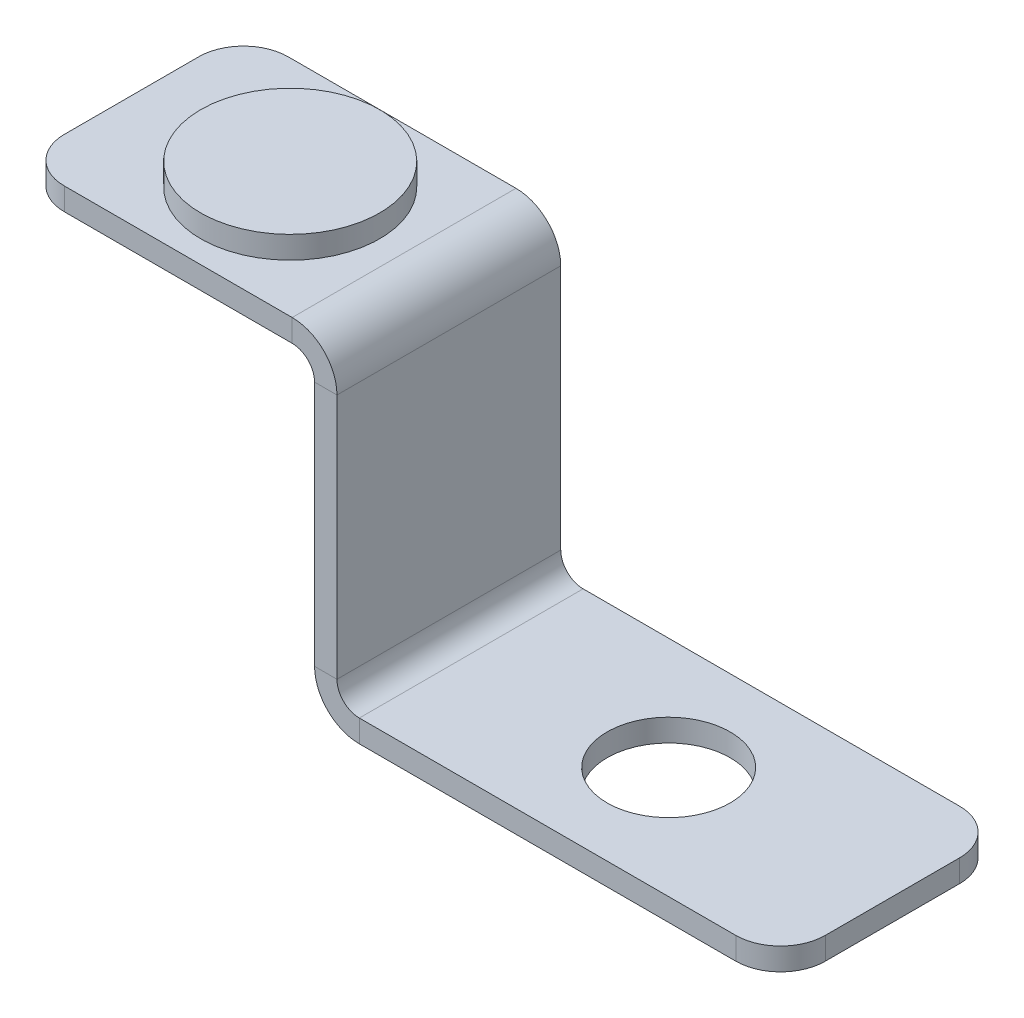
ISO-10303-21;
HEADER;
FILE_DESCRIPTION(('STEP AP214'),'2;1');
FILE_NAME('part.step','',(''),(''),'','','');
FILE_SCHEMA(('AUTOMOTIVE_DESIGN { 1 0 10303 214 1 1 1 1 }'));
ENDSEC;
DATA;
#1=APPLICATION_CONTEXT('core data for automotive mechanical design processes');
#2=APPLICATION_PROTOCOL_DEFINITION('international standard','automotive_design',2000,#1);
#3=PRODUCT_CONTEXT('',#1,'mechanical');
#4=PRODUCT('Part','Part','',(#3));
#5=PRODUCT_RELATED_PRODUCT_CATEGORY('part','',(#4));
#6=PRODUCT_DEFINITION_FORMATION('','',#4);
#7=PRODUCT_DEFINITION_CONTEXT('part definition',#1,'design');
#8=PRODUCT_DEFINITION('design','',#6,#7);
#9=PRODUCT_DEFINITION_SHAPE('','',#8);
#10=(LENGTH_UNIT() NAMED_UNIT(*) SI_UNIT(.MILLI.,.METRE.));
#11=(NAMED_UNIT(*) PLANE_ANGLE_UNIT() SI_UNIT($,.RADIAN.));
#12=(NAMED_UNIT(*) SI_UNIT($,.STERADIAN.) SOLID_ANGLE_UNIT());
#13=UNCERTAINTY_MEASURE_WITH_UNIT(LENGTH_MEASURE(1.E-05),#10,'distance_accuracy_value','');
#14=(GEOMETRIC_REPRESENTATION_CONTEXT(3) GLOBAL_UNCERTAINTY_ASSIGNED_CONTEXT((#13)) GLOBAL_UNIT_ASSIGNED_CONTEXT((#10,
#11,#12)) REPRESENTATION_CONTEXT('',''));
#15=CARTESIAN_POINT('',(0.,0.,0.));
#16=DIRECTION('',(0.,0.,1.));
#17=DIRECTION('',(1.,0.,0.));
#18=AXIS2_PLACEMENT_3D('',#15,#16,#17);
#19=CARTESIAN_POINT('',(7.08904862254811,16.,-5.));
#20=DIRECTION('',(0.,-1.,0.));
#21=DIRECTION('',(1.,0.,0.));
#22=AXIS2_PLACEMENT_3D('',#19,#20,#21);
#23=CYLINDRICAL_SURFACE('',#22,4.);
#24=CARTESIAN_POINT('',(7.08904862254811,16.,-5.));
#25=DIRECTION('',(0.,1.,0.));
#26=DIRECTION('',(-1.,0.,0.));
#27=AXIS2_PLACEMENT_3D('',#24,#25,#26);
#28=CIRCLE('',#27,4.);
#29=CARTESIAN_POINT('',(3.08904862254811,16.,-5.));
#30=VERTEX_POINT('',#29);
#31=EDGE_CURVE('E12',#30,#30,#28,.T.);
#32=ORIENTED_EDGE('',*,*,#31,.F.);
#33=EDGE_LOOP('',(#32));
#34=FACE_BOUND('',#33,.T.);
#35=CARTESIAN_POINT('',(7.08904862254811,15.,-5.));
#36=DIRECTION('',(0.,1.,0.));
#37=DIRECTION('',(-1.,0.,0.));
#38=AXIS2_PLACEMENT_3D('',#35,#36,#37);
#39=CIRCLE('',#38,4.);
#40=CARTESIAN_POINT('',(3.08904862254811,15.,-5.));
#41=VERTEX_POINT('',#40);
#42=EDGE_CURVE('E55',#41,#41,#39,.T.);
#43=ORIENTED_EDGE('',*,*,#42,.T.);
#44=EDGE_LOOP('',(#43));
#45=FACE_BOUND('',#44,.T.);
#46=ADVANCED_FACE('F52',(#34,#45),#23,.T.);
#47=CARTESIAN_POINT('',(7.08904862254811,16.,-5.));
#48=DIRECTION('',(0.,1.,0.));
#49=DIRECTION('',(-1.,0.,0.));
#50=AXIS2_PLACEMENT_3D('',#47,#48,#49);
#51=PLANE('',#50);
#52=ORIENTED_EDGE('',*,*,#31,.T.);
#53=EDGE_LOOP('',(#52));
#54=FACE_BOUND('',#53,.T.);
#55=ADVANCED_FACE('F67',(#54),#51,.T.);
#56=CARTESIAN_POINT('',(7.08904862254811,15.,-5.));
#57=DIRECTION('',(0.,1.,0.));
#58=DIRECTION('',(-1.,0.,0.));
#59=AXIS2_PLACEMENT_3D('',#56,#57,#58);
#60=PLANE('',#59);
#61=ORIENTED_EDGE('',*,*,#42,.F.);
#62=EDGE_LOOP('',(#61));
#63=FACE_BOUND('',#62,.T.);
#64=ADVANCED_FACE('F65',(#63),#60,.F.);
#65=CLOSED_SHELL('',(#46,#55,#64));
#66=MANIFOLD_SOLID_BREP('B2',#65);
#67=CARTESIAN_POINT('',(14.1780972450962,12.8219027549038,0.));
#68=DIRECTION('',(0.,0.,-1.));
#69=DIRECTION('',(0.,1.,0.));
#70=AXIS2_PLACEMENT_3D('',#67,#68,#69);
#71=PLANE('',#70);
#72=DIRECTION('',(0.,-1.,0.));
#73=VECTOR('',#72,1.);
#74=CARTESIAN_POINT('',(14.1780972450962,12.8219027549038,0.));
#75=LINE('',#74,#73);
#76=CARTESIAN_POINT('',(14.1780972450962,13.,0.));
#77=VERTEX_POINT('',#76);
#78=CARTESIAN_POINT('',(14.1780972450962,2.,0.));
#79=VERTEX_POINT('',#78);
#80=EDGE_CURVE('E344',#77,#79,#75,.T.);
#81=ORIENTED_EDGE('',*,*,#80,.F.);
#82=DIRECTION('',(-1.,0.,0.));
#83=VECTOR('',#82,1.);
#84=CARTESIAN_POINT('',(14.1780972450962,13.,0.));
#85=LINE('',#84,#83);
#86=CARTESIAN_POINT('',(13.1780972450962,13.,0.));
#87=VERTEX_POINT('',#86);
#88=EDGE_CURVE('E50',#77,#87,#85,.T.);
#89=ORIENTED_EDGE('',*,*,#88,.T.);
#90=DIRECTION('',(0.,-1.,0.));
#91=VECTOR('',#90,1.);
#92=CARTESIAN_POINT('',(13.1780972450962,12.8219027549038,0.));
#93=LINE('',#92,#91);
#94=CARTESIAN_POINT('',(13.1780972450962,2.00000000000001,0.));
#95=VERTEX_POINT('',#94);
#96=EDGE_CURVE('E359',#87,#95,#93,.T.);
#97=ORIENTED_EDGE('',*,*,#96,.T.);
#98=DIRECTION('',(-1.,0.,0.));
#99=VECTOR('',#98,1.);
#100=CARTESIAN_POINT('',(14.1780972450962,2.,0.));
#101=LINE('',#100,#99);
#102=EDGE_CURVE('E343',#79,#95,#101,.T.);
#103=ORIENTED_EDGE('',*,*,#102,.F.);
#104=EDGE_LOOP('',(#81,#89,#97,#103));
#105=FACE_BOUND('',#104,.T.);
#106=ADVANCED_FACE('F92',(#105),#71,.F.);
#107=CARTESIAN_POINT('',(14.1780972450962,12.8219027549038,-10.));
#108=DIRECTION('',(0.,0.,1.));
#109=DIRECTION('',(0.,-1.,0.));
#110=AXIS2_PLACEMENT_3D('',#107,#108,#109);
#111=PLANE('',#110);
#112=DIRECTION('',(0.,1.,0.));
#113=VECTOR('',#112,1.);
#114=CARTESIAN_POINT('',(13.1780972450962,12.8219027549038,-10.));
#115=LINE('',#114,#113);
#116=CARTESIAN_POINT('',(13.1780972450962,2.00000000000001,-10.));
#117=VERTEX_POINT('',#116);
#118=CARTESIAN_POINT('',(13.1780972450962,13.,-10.));
#119=VERTEX_POINT('',#118);
#120=EDGE_CURVE('E114',#117,#119,#115,.T.);
#121=ORIENTED_EDGE('',*,*,#120,.T.);
#122=DIRECTION('',(1.,0.,0.));
#123=VECTOR('',#122,1.);
#124=CARTESIAN_POINT('',(14.1780972450962,13.,-10.));
#125=LINE('',#124,#123);
#126=CARTESIAN_POINT('',(14.1780972450962,13.,-10.));
#127=VERTEX_POINT('',#126);
#128=EDGE_CURVE('E355',#119,#127,#125,.T.);
#129=ORIENTED_EDGE('',*,*,#128,.T.);
#130=DIRECTION('',(0.,1.,0.));
#131=VECTOR('',#130,1.);
#132=CARTESIAN_POINT('',(14.1780972450962,12.8219027549038,-10.));
#133=LINE('',#132,#131);
#134=CARTESIAN_POINT('',(14.1780972450962,2.,-10.));
#135=VERTEX_POINT('',#134);
#136=EDGE_CURVE('E95',#135,#127,#133,.T.);
#137=ORIENTED_EDGE('',*,*,#136,.F.);
#138=DIRECTION('',(1.,0.,0.));
#139=VECTOR('',#138,1.);
#140=CARTESIAN_POINT('',(14.1780972450962,2.,-10.));
#141=LINE('',#140,#139);
#142=EDGE_CURVE('E349',#117,#135,#141,.T.);
#143=ORIENTED_EDGE('',*,*,#142,.F.);
#144=EDGE_LOOP('',(#121,#129,#137,#143));
#145=FACE_BOUND('',#144,.T.);
#146=ADVANCED_FACE('F369',(#145),#111,.F.);
#147=CARTESIAN_POINT('',(14.1780972450961,-17.1780972450962,-8.));
#148=DIRECTION('',(-1.,0.,0.));
#149=DIRECTION('',(0.,0.,-1.));
#150=AXIS2_PLACEMENT_3D('',#147,#148,#149);
#151=PLANE('',#150);
#152=ORIENTED_EDGE('',*,*,#136,.T.);
#153=DIRECTION('',(0.,0.,1.));
#154=VECTOR('',#153,1.);
#155=CARTESIAN_POINT('',(14.1780972450962,13.,-8.));
#156=LINE('',#155,#154);
#157=EDGE_CURVE('E352',#127,#77,#156,.T.);
#158=ORIENTED_EDGE('',*,*,#157,.T.);
#159=ORIENTED_EDGE('',*,*,#80,.T.);
#160=DIRECTION('',(0.,0.,1.));
#161=VECTOR('',#160,1.);
#162=CARTESIAN_POINT('',(14.1780972450962,2.,-8.));
#163=LINE('',#162,#161);
#164=EDGE_CURVE('E340',#135,#79,#163,.T.);
#165=ORIENTED_EDGE('',*,*,#164,.F.);
#166=EDGE_LOOP('',(#152,#158,#159,#165));
#167=FACE_BOUND('',#166,.T.);
#168=ADVANCED_FACE('F366',(#167),#151,.F.);
#169=CARTESIAN_POINT('',(13.1780972450961,-17.1780972450962,-8.));
#170=DIRECTION('',(-1.,0.,0.));
#171=DIRECTION('',(0.,0.,-1.));
#172=AXIS2_PLACEMENT_3D('',#169,#170,#171);
#173=PLANE('',#172);
#174=DIRECTION('',(0.,0.,1.));
#175=VECTOR('',#174,1.);
#176=CARTESIAN_POINT('',(13.1780972450962,13.,-8.));
#177=LINE('',#176,#175);
#178=EDGE_CURVE('E100',#119,#87,#177,.T.);
#179=ORIENTED_EDGE('',*,*,#178,.F.);
#180=ORIENTED_EDGE('',*,*,#120,.F.);
#181=DIRECTION('',(0.,0.,1.));
#182=VECTOR('',#181,1.);
#183=CARTESIAN_POINT('',(13.1780972450962,2.00000000000001,-8.));
#184=LINE('',#183,#182);
#185=EDGE_CURVE('E347',#117,#95,#184,.T.);
#186=ORIENTED_EDGE('',*,*,#185,.T.);
#187=ORIENTED_EDGE('',*,*,#96,.F.);
#188=EDGE_LOOP('',(#179,#180,#186,#187));
#189=FACE_BOUND('',#188,.T.);
#190=ADVANCED_FACE('F455',(#189),#173,.T.);
#191=CARTESIAN_POINT('',(32.,1.,-8.));
#192=DIRECTION('',(0.,-1.,0.));
#193=DIRECTION('',(0.,0.,-1.));
#194=AXIS2_PLACEMENT_3D('',#191,#192,#193);
#195=CYLINDRICAL_SURFACE('',#194,2.);
#196=CARTESIAN_POINT('',(32.,0.,-8.));
#197=DIRECTION('',(0.,1.,0.));
#198=DIRECTION('',(0.,0.,-1.));
#199=AXIS2_PLACEMENT_3D('',#196,#197,#198);
#200=CIRCLE('',#199,2.);
#201=CARTESIAN_POINT('',(34.,0.,-7.99999999999999));
#202=VERTEX_POINT('',#201);
#203=CARTESIAN_POINT('',(32.,0.,-10.));
#204=VERTEX_POINT('',#203);
#205=EDGE_CURVE('E336',#202,#204,#200,.T.);
#206=ORIENTED_EDGE('',*,*,#205,.T.);
#207=DIRECTION('',(0.,-1.,0.));
#208=VECTOR('',#207,1.);
#209=CARTESIAN_POINT('',(32.,1.,-10.));
#210=LINE('',#209,#208);
#211=CARTESIAN_POINT('',(32.,1.,-10.));
#212=VERTEX_POINT('',#211);
#213=EDGE_CURVE('E288',#212,#204,#210,.T.);
#214=ORIENTED_EDGE('',*,*,#213,.F.);
#215=CARTESIAN_POINT('',(32.,1.,-8.));
#216=DIRECTION('',(0.,1.,0.));
#217=DIRECTION('',(0.,0.,-1.));
#218=AXIS2_PLACEMENT_3D('',#215,#216,#217);
#219=CIRCLE('',#218,2.);
#220=CARTESIAN_POINT('',(34.,1.,-7.99999999999999));
#221=VERTEX_POINT('',#220);
#222=EDGE_CURVE('E305',#221,#212,#219,.T.);
#223=ORIENTED_EDGE('',*,*,#222,.F.);
#224=DIRECTION('',(0.,-1.,0.));
#225=VECTOR('',#224,1.);
#226=CARTESIAN_POINT('',(34.,1.,-7.99999999999999));
#227=LINE('',#226,#225);
#228=EDGE_CURVE('E333',#221,#202,#227,.T.);
#229=ORIENTED_EDGE('',*,*,#228,.T.);
#230=EDGE_LOOP('',(#206,#214,#223,#229));
#231=FACE_BOUND('',#230,.T.);
#232=ADVANCED_FACE('F451',(#231),#195,.T.);
#233=CARTESIAN_POINT('',(34.,1.,-2.00000000000002));
#234=DIRECTION('',(-1.,0.,0.));
#235=DIRECTION('',(0.,0.,1.));
#236=AXIS2_PLACEMENT_3D('',#233,#234,#235);
#237=PLANE('',#236);
#238=DIRECTION('',(0.,0.,-1.));
#239=VECTOR('',#238,1.);
#240=CARTESIAN_POINT('',(34.,0.,-2.00000000000002));
#241=LINE('',#240,#239);
#242=CARTESIAN_POINT('',(34.,0.,-2.00000000000002));
#243=VERTEX_POINT('',#242);
#244=EDGE_CURVE('E331',#243,#202,#241,.T.);
#245=ORIENTED_EDGE('',*,*,#244,.T.);
#246=ORIENTED_EDGE('',*,*,#228,.F.);
#247=DIRECTION('',(0.,0.,-1.));
#248=VECTOR('',#247,1.);
#249=CARTESIAN_POINT('',(34.,1.,-2.00000000000002));
#250=LINE('',#249,#248);
#251=CARTESIAN_POINT('',(34.,1.,-2.00000000000002));
#252=VERTEX_POINT('',#251);
#253=EDGE_CURVE('E308',#252,#221,#250,.T.);
#254=ORIENTED_EDGE('',*,*,#253,.F.);
#255=DIRECTION('',(0.,-1.,0.));
#256=VECTOR('',#255,1.);
#257=CARTESIAN_POINT('',(34.,1.,-2.00000000000002));
#258=LINE('',#257,#256);
#259=EDGE_CURVE('E328',#252,#243,#258,.T.);
#260=ORIENTED_EDGE('',*,*,#259,.T.);
#261=EDGE_LOOP('',(#245,#246,#254,#260));
#262=FACE_BOUND('',#261,.T.);
#263=ADVANCED_FACE('F454',(#262),#237,.F.);
#264=CARTESIAN_POINT('',(32.,1.,-2.));
#265=DIRECTION('',(0.,-1.,0.));
#266=DIRECTION('',(0.,0.,-1.));
#267=AXIS2_PLACEMENT_3D('',#264,#265,#266);
#268=CYLINDRICAL_SURFACE('',#267,2.);
#269=CARTESIAN_POINT('',(32.,0.,-2.));
#270=DIRECTION('',(0.,1.,0.));
#271=DIRECTION('',(0.,0.,1.));
#272=AXIS2_PLACEMENT_3D('',#269,#270,#271);
#273=CIRCLE('',#272,2.);
#274=CARTESIAN_POINT('',(32.,0.,0.));
#275=VERTEX_POINT('',#274);
#276=EDGE_CURVE('E326',#275,#243,#273,.T.);
#277=ORIENTED_EDGE('',*,*,#276,.T.);
#278=ORIENTED_EDGE('',*,*,#259,.F.);
#279=CARTESIAN_POINT('',(32.,1.,-2.));
#280=DIRECTION('',(0.,1.,0.));
#281=DIRECTION('',(0.,0.,1.));
#282=AXIS2_PLACEMENT_3D('',#279,#280,#281);
#283=CIRCLE('',#282,2.);
#284=CARTESIAN_POINT('',(32.,1.,0.));
#285=VERTEX_POINT('',#284);
#286=EDGE_CURVE('E310',#285,#252,#283,.T.);
#287=ORIENTED_EDGE('',*,*,#286,.F.);
#288=DIRECTION('',(0.,-1.,0.));
#289=VECTOR('',#288,1.);
#290=CARTESIAN_POINT('',(32.,1.,0.));
#291=LINE('',#290,#289);
#292=EDGE_CURVE('E323',#285,#275,#291,.T.);
#293=ORIENTED_EDGE('',*,*,#292,.T.);
#294=EDGE_LOOP('',(#277,#278,#287,#293));
#295=FACE_BOUND('',#294,.T.);
#296=ADVANCED_FACE('F459',(#295),#268,.T.);
#297=CARTESIAN_POINT('',(24.,1.,-5.));
#298=DIRECTION('',(0.,-1.,0.));
#299=DIRECTION('',(0.,0.,-1.));
#300=AXIS2_PLACEMENT_3D('',#297,#298,#299);
#301=CYLINDRICAL_SURFACE('',#300,2.75);
#302=CARTESIAN_POINT('',(24.,1.,-5.));
#303=DIRECTION('',(0.,1.,0.));
#304=DIRECTION('',(0.,0.,1.));
#305=AXIS2_PLACEMENT_3D('',#302,#303,#304);
#306=CIRCLE('',#305,2.75);
#307=CARTESIAN_POINT('',(24.,1.,-2.25));
#308=VERTEX_POINT('',#307);
#309=EDGE_CURVE('E320',#308,#308,#306,.T.);
#310=ORIENTED_EDGE('',*,*,#309,.T.);
#311=EDGE_LOOP('',(#310));
#312=FACE_BOUND('',#311,.T.);
#313=CARTESIAN_POINT('',(24.,0.,-5.));
#314=DIRECTION('',(0.,1.,0.));
#315=DIRECTION('',(0.,0.,1.));
#316=AXIS2_PLACEMENT_3D('',#313,#314,#315);
#317=CIRCLE('',#316,2.75);
#318=CARTESIAN_POINT('',(24.,0.,-2.25));
#319=VERTEX_POINT('',#318);
#320=EDGE_CURVE('E297',#319,#319,#317,.T.);
#321=ORIENTED_EDGE('',*,*,#320,.F.);
#322=EDGE_LOOP('',(#321));
#323=FACE_BOUND('',#322,.T.);
#324=ADVANCED_FACE('F463',(#312,#323),#301,.F.);
#325=CARTESIAN_POINT('',(32.,1.,-8.));
#326=DIRECTION('',(0.,-1.,0.));
#327=DIRECTION('',(0.,0.,-1.));
#328=AXIS2_PLACEMENT_3D('',#325,#326,#327);
#329=PLANE('',#328);
#330=ORIENTED_EDGE('',*,*,#309,.F.);
#331=EDGE_LOOP('',(#330));
#332=FACE_BOUND('',#331,.T.);
#333=DIRECTION('',(-1.,0.,0.));
#334=VECTOR('',#333,1.);
#335=CARTESIAN_POINT('',(2.00000000000001,1.,-10.));
#336=LINE('',#335,#334);
#337=CARTESIAN_POINT('',(15.1780972450962,1.,-10.));
#338=VERTEX_POINT('',#337);
#339=EDGE_CURVE('E317',#212,#338,#336,.T.);
#340=ORIENTED_EDGE('',*,*,#339,.T.);
#341=DIRECTION('',(0.,0.,1.));
#342=VECTOR('',#341,1.);
#343=CARTESIAN_POINT('',(15.1780972450962,1.,-8.));
#344=LINE('',#343,#342);
#345=CARTESIAN_POINT('',(15.1780972450962,1.,0.));
#346=VERTEX_POINT('',#345);
#347=EDGE_CURVE('E314',#338,#346,#344,.T.);
#348=ORIENTED_EDGE('',*,*,#347,.T.);
#349=DIRECTION('',(1.,0.,0.));
#350=VECTOR('',#349,1.);
#351=CARTESIAN_POINT('',(2.00000000000001,1.,0.));
#352=LINE('',#351,#350);
#353=EDGE_CURVE('E312',#346,#285,#352,.T.);
#354=ORIENTED_EDGE('',*,*,#353,.T.);
#355=ORIENTED_EDGE('',*,*,#286,.T.);
#356=ORIENTED_EDGE('',*,*,#253,.T.);
#357=ORIENTED_EDGE('',*,*,#222,.T.);
#358=EDGE_LOOP('',(#340,#348,#354,#355,#356,#357));
#359=FACE_BOUND('',#358,.T.);
#360=ADVANCED_FACE('F434',(#332,#359),#329,.F.);
#361=CARTESIAN_POINT('',(2.00000000000001,1.,0.));
#362=DIRECTION('',(0.,0.,-1.));
#363=DIRECTION('',(-1.,0.,0.));
#364=AXIS2_PLACEMENT_3D('',#361,#362,#363);
#365=PLANE('',#364);
#366=ORIENTED_EDGE('',*,*,#353,.F.);
#367=DIRECTION('',(0.,-1.,0.));
#368=VECTOR('',#367,1.);
#369=CARTESIAN_POINT('',(15.1780972450962,1.,0.));
#370=LINE('',#369,#368);
#371=CARTESIAN_POINT('',(15.1780972450962,0.,0.));
#372=VERTEX_POINT('',#371);
#373=EDGE_CURVE('E302',#346,#372,#370,.T.);
#374=ORIENTED_EDGE('',*,*,#373,.T.);
#375=DIRECTION('',(1.,0.,0.));
#376=VECTOR('',#375,1.);
#377=CARTESIAN_POINT('',(2.00000000000001,0.,0.));
#378=LINE('',#377,#376);
#379=EDGE_CURVE('E300',#372,#275,#378,.T.);
#380=ORIENTED_EDGE('',*,*,#379,.T.);
#381=ORIENTED_EDGE('',*,*,#292,.F.);
#382=EDGE_LOOP('',(#366,#374,#380,#381));
#383=FACE_BOUND('',#382,.T.);
#384=ADVANCED_FACE('F429',(#383),#365,.F.);
#385=CARTESIAN_POINT('',(32.,0.,-8.));
#386=DIRECTION('',(0.,-1.,0.));
#387=DIRECTION('',(0.,0.,-1.));
#388=AXIS2_PLACEMENT_3D('',#385,#386,#387);
#389=PLANE('',#388);
#390=DIRECTION('',(0.,0.,1.));
#391=VECTOR('',#390,1.);
#392=CARTESIAN_POINT('',(15.1780972450962,0.,-8.));
#393=LINE('',#392,#391);
#394=CARTESIAN_POINT('',(15.1780972450962,0.,-10.));
#395=VERTEX_POINT('',#394);
#396=EDGE_CURVE('E283',#395,#372,#393,.T.);
#397=ORIENTED_EDGE('',*,*,#396,.F.);
#398=DIRECTION('',(-1.,0.,0.));
#399=VECTOR('',#398,1.);
#400=CARTESIAN_POINT('',(2.00000000000001,0.,-10.));
#401=LINE('',#400,#399);
#402=EDGE_CURVE('E294',#204,#395,#401,.T.);
#403=ORIENTED_EDGE('',*,*,#402,.F.);
#404=ORIENTED_EDGE('',*,*,#205,.F.);
#405=ORIENTED_EDGE('',*,*,#244,.F.);
#406=ORIENTED_EDGE('',*,*,#276,.F.);
#407=ORIENTED_EDGE('',*,*,#379,.F.);
#408=EDGE_LOOP('',(#397,#403,#404,#405,#406,#407));
#409=FACE_BOUND('',#408,.T.);
#410=ORIENTED_EDGE('',*,*,#320,.T.);
#411=EDGE_LOOP('',(#410));
#412=FACE_BOUND('',#411,.T.);
#413=ADVANCED_FACE('F421',(#409,#412),#389,.T.);
#414=CARTESIAN_POINT('',(2.00000000000001,1.,-10.));
#415=DIRECTION('',(0.,0.,1.));
#416=DIRECTION('',(1.,0.,0.));
#417=AXIS2_PLACEMENT_3D('',#414,#415,#416);
#418=PLANE('',#417);
#419=ORIENTED_EDGE('',*,*,#402,.T.);
#420=DIRECTION('',(0.,1.,0.));
#421=VECTOR('',#420,1.);
#422=CARTESIAN_POINT('',(15.1780972450962,1.,-10.));
#423=LINE('',#422,#421);
#424=EDGE_CURVE('E291',#395,#338,#423,.T.);
#425=ORIENTED_EDGE('',*,*,#424,.T.);
#426=ORIENTED_EDGE('',*,*,#339,.F.);
#427=ORIENTED_EDGE('',*,*,#213,.T.);
#428=EDGE_LOOP('',(#419,#425,#426,#427));
#429=FACE_BOUND('',#428,.T.);
#430=ADVANCED_FACE('F438',(#429),#418,.F.);
#431=CARTESIAN_POINT('',(15.1780972450962,2.,-10.));
#432=DIRECTION('',(0.,0.,1.));
#433=DIRECTION('',(1.,0.,0.));
#434=AXIS2_PLACEMENT_3D('',#431,#432,#433);
#435=PLANE('',#434);
#436=ORIENTED_EDGE('',*,*,#424,.F.);
#437=CARTESIAN_POINT('',(15.1780972450962,2.,-10.));
#438=DIRECTION('',(0.,0.,1.));
#439=DIRECTION('',(1.,0.,0.));
#440=AXIS2_PLACEMENT_3D('',#437,#438,#439);
#441=CIRCLE('',#440,2.);
#442=EDGE_CURVE('E272',#395,#117,#441,.F.);
#443=ORIENTED_EDGE('',*,*,#442,.T.);
#444=ORIENTED_EDGE('',*,*,#142,.T.);
#445=CARTESIAN_POINT('',(15.1780972450962,2.,-10.));
#446=DIRECTION('',(0.,0.,-1.));
#447=DIRECTION('',(-1.,0.,0.));
#448=AXIS2_PLACEMENT_3D('',#445,#446,#447);
#449=CIRCLE('',#448,1.);
#450=EDGE_CURVE('E276',#338,#135,#449,.T.);
#451=ORIENTED_EDGE('',*,*,#450,.F.);
#452=EDGE_LOOP('',(#436,#443,#444,#451));
#453=FACE_BOUND('',#452,.T.);
#454=ADVANCED_FACE('F440',(#453),#435,.F.);
#455=CARTESIAN_POINT('',(15.1780972450962,2.,0.));
#456=DIRECTION('',(0.,0.,-1.));
#457=DIRECTION('',(-1.,0.,0.));
#458=AXIS2_PLACEMENT_3D('',#455,#456,#457);
#459=PLANE('',#458);
#460=ORIENTED_EDGE('',*,*,#102,.T.);
#461=CARTESIAN_POINT('',(15.1780972450962,2.,0.));
#462=DIRECTION('',(0.,0.,1.));
#463=DIRECTION('',(1.,0.,0.));
#464=AXIS2_PLACEMENT_3D('',#461,#462,#463);
#465=CIRCLE('',#464,2.);
#466=EDGE_CURVE('E280',#95,#372,#465,.T.);
#467=ORIENTED_EDGE('',*,*,#466,.T.);
#468=ORIENTED_EDGE('',*,*,#373,.F.);
#469=CARTESIAN_POINT('',(15.1780972450962,2.,0.));
#470=DIRECTION('',(0.,0.,1.));
#471=DIRECTION('',(1.,0.,0.));
#472=AXIS2_PLACEMENT_3D('',#469,#470,#471);
#473=CIRCLE('',#472,0.999999999999999);
#474=EDGE_CURVE('E279',#79,#346,#473,.T.);
#475=ORIENTED_EDGE('',*,*,#474,.F.);
#476=EDGE_LOOP('',(#460,#467,#468,#475));
#477=FACE_BOUND('',#476,.T.);
#478=ADVANCED_FACE('F413',(#477),#459,.F.);
#479=CARTESIAN_POINT('',(15.1780972450962,2.,-15.3223859875328));
#480=DIRECTION('',(0.,0.,1.));
#481=DIRECTION('',(1.,0.,0.));
#482=AXIS2_PLACEMENT_3D('',#479,#480,#481);
#483=CYLINDRICAL_SURFACE('',#482,1.);
#484=ORIENTED_EDGE('',*,*,#474,.T.);
#485=ORIENTED_EDGE('',*,*,#347,.F.);
#486=ORIENTED_EDGE('',*,*,#450,.T.);
#487=ORIENTED_EDGE('',*,*,#164,.T.);
#488=EDGE_LOOP('',(#484,#485,#486,#487));
#489=FACE_BOUND('',#488,.T.);
#490=ADVANCED_FACE('F432',(#489),#483,.F.);
#491=CARTESIAN_POINT('',(15.1780972450962,2.,-15.3223859875328));
#492=DIRECTION('',(0.,0.,1.));
#493=DIRECTION('',(1.,0.,0.));
#494=AXIS2_PLACEMENT_3D('',#491,#492,#493);
#495=CYLINDRICAL_SURFACE('',#494,2.);
#496=ORIENTED_EDGE('',*,*,#466,.F.);
#497=ORIENTED_EDGE('',*,*,#185,.F.);
#498=ORIENTED_EDGE('',*,*,#442,.F.);
#499=ORIENTED_EDGE('',*,*,#396,.T.);
#500=EDGE_LOOP('',(#496,#497,#498,#499));
#501=FACE_BOUND('',#500,.T.);
#502=ADVANCED_FACE('F417',(#501),#495,.T.);
#503=CARTESIAN_POINT('',(12.1780972450962,13.,-10.));
#504=DIRECTION('',(0.,0.,-1.));
#505=DIRECTION('',(-1.,0.,0.));
#506=AXIS2_PLACEMENT_3D('',#503,#504,#505);
#507=PLANE('',#506);
#508=ORIENTED_EDGE('',*,*,#128,.F.);
#509=CARTESIAN_POINT('',(12.1780972450962,13.,-10.));
#510=DIRECTION('',(0.,0.,1.));
#511=DIRECTION('',(1.,0.,0.));
#512=AXIS2_PLACEMENT_3D('',#509,#510,#511);
#513=CIRCLE('',#512,1.);
#514=CARTESIAN_POINT('',(12.1780972450962,14.,-10.));
#515=VERTEX_POINT('',#514);
#516=EDGE_CURVE('E235',#119,#515,#513,.T.);
#517=ORIENTED_EDGE('',*,*,#516,.T.);
#518=DIRECTION('',(0.,1.,0.));
#519=VECTOR('',#518,1.);
#520=CARTESIAN_POINT('',(12.1780972450962,15.,-10.));
#521=LINE('',#520,#519);
#522=CARTESIAN_POINT('',(12.1780972450962,15.,-10.));
#523=VERTEX_POINT('',#522);
#524=EDGE_CURVE('E259',#515,#523,#521,.T.);
#525=ORIENTED_EDGE('',*,*,#524,.T.);
#526=CARTESIAN_POINT('',(12.1780972450962,13.,-10.));
#527=DIRECTION('',(0.,0.,1.));
#528=DIRECTION('',(1.,0.,0.));
#529=AXIS2_PLACEMENT_3D('',#526,#527,#528);
#530=CIRCLE('',#529,2.);
#531=EDGE_CURVE('E265',#127,#523,#530,.T.);
#532=ORIENTED_EDGE('',*,*,#531,.F.);
#533=EDGE_LOOP('',(#508,#517,#525,#532));
#534=FACE_BOUND('',#533,.T.);
#535=ADVANCED_FACE('F371',(#534),#507,.T.);
#536=CARTESIAN_POINT('',(12.1780972450962,13.,0.));
#537=DIRECTION('',(0.,0.,1.));
#538=DIRECTION('',(1.,0.,0.));
#539=AXIS2_PLACEMENT_3D('',#536,#537,#538);
#540=PLANE('',#539);
#541=DIRECTION('',(0.,-1.,0.));
#542=VECTOR('',#541,1.);
#543=CARTESIAN_POINT('',(12.1780972450962,15.,0.));
#544=LINE('',#543,#542);
#545=CARTESIAN_POINT('',(12.1780972450962,15.,0.));
#546=VERTEX_POINT('',#545);
#547=CARTESIAN_POINT('',(12.1780972450962,14.,0.));
#548=VERTEX_POINT('',#547);
#549=EDGE_CURVE('E214',#546,#548,#544,.T.);
#550=ORIENTED_EDGE('',*,*,#549,.T.);
#551=CARTESIAN_POINT('',(12.1780972450962,13.,0.));
#552=DIRECTION('',(0.,0.,1.));
#553=DIRECTION('',(1.,0.,0.));
#554=AXIS2_PLACEMENT_3D('',#551,#552,#553);
#555=CIRCLE('',#554,1.);
#556=EDGE_CURVE('E269',#548,#87,#555,.F.);
#557=ORIENTED_EDGE('',*,*,#556,.T.);
#558=ORIENTED_EDGE('',*,*,#88,.F.);
#559=CARTESIAN_POINT('',(12.1780972450962,13.,0.));
#560=DIRECTION('',(0.,0.,-1.));
#561=DIRECTION('',(-1.,0.,0.));
#562=AXIS2_PLACEMENT_3D('',#559,#560,#561);
#563=CIRCLE('',#562,2.);
#564=EDGE_CURVE('E268',#546,#77,#563,.T.);
#565=ORIENTED_EDGE('',*,*,#564,.F.);
#566=EDGE_LOOP('',(#550,#557,#558,#565));
#567=FACE_BOUND('',#566,.T.);
#568=ADVANCED_FACE('F380',(#567),#540,.T.);
#569=CARTESIAN_POINT('',(12.1780972450962,13.,-15.3223859875328));
#570=DIRECTION('',(0.,0.,1.));
#571=DIRECTION('',(1.,0.,0.));
#572=AXIS2_PLACEMENT_3D('',#569,#570,#571);
#573=CYLINDRICAL_SURFACE('',#572,2.);
#574=ORIENTED_EDGE('',*,*,#564,.T.);
#575=ORIENTED_EDGE('',*,*,#157,.F.);
#576=ORIENTED_EDGE('',*,*,#531,.T.);
#577=DIRECTION('',(0.,0.,1.));
#578=VECTOR('',#577,1.);
#579=CARTESIAN_POINT('',(12.1780972450962,15.,-8.));
#580=LINE('',#579,#578);
#581=EDGE_CURVE('E263',#523,#546,#580,.T.);
#582=ORIENTED_EDGE('',*,*,#581,.T.);
#583=EDGE_LOOP('',(#574,#575,#576,#582));
#584=FACE_BOUND('',#583,.T.);
#585=ADVANCED_FACE('F383',(#584),#573,.T.);
#586=CARTESIAN_POINT('',(12.1780972450962,13.,-15.3223859875328));
#587=DIRECTION('',(0.,0.,1.));
#588=DIRECTION('',(1.,0.,0.));
#589=AXIS2_PLACEMENT_3D('',#586,#587,#588);
#590=CYLINDRICAL_SURFACE('',#589,1.);
#591=ORIENTED_EDGE('',*,*,#556,.F.);
#592=DIRECTION('',(0.,0.,1.));
#593=VECTOR('',#592,1.);
#594=CARTESIAN_POINT('',(12.1780972450962,14.,-8.));
#595=LINE('',#594,#593);
#596=EDGE_CURVE('E233',#515,#548,#595,.T.);
#597=ORIENTED_EDGE('',*,*,#596,.F.);
#598=ORIENTED_EDGE('',*,*,#516,.F.);
#599=ORIENTED_EDGE('',*,*,#178,.T.);
#600=EDGE_LOOP('',(#591,#597,#598,#599));
#601=FACE_BOUND('',#600,.T.);
#602=ADVANCED_FACE('F373',(#601),#590,.F.);
#603=CARTESIAN_POINT('',(2.00000000000004,15.,-2.));
#604=DIRECTION('',(0.,-1.,0.));
#605=DIRECTION('',(0.,0.,-1.));
#606=AXIS2_PLACEMENT_3D('',#603,#604,#605);
#607=CYLINDRICAL_SURFACE('',#606,2.);
#608=CARTESIAN_POINT('',(2.00000000000004,14.,-2.));
#609=DIRECTION('',(0.,1.,0.));
#610=DIRECTION('',(0.,0.,1.));
#611=AXIS2_PLACEMENT_3D('',#608,#609,#610);
#612=CIRCLE('',#611,2.);
#613=CARTESIAN_POINT('',(0.,14.,-2.00000000000001));
#614=VERTEX_POINT('',#613);
#615=CARTESIAN_POINT('',(2.00000000000004,14.,0.));
#616=VERTEX_POINT('',#615);
#617=EDGE_CURVE('E231',#614,#616,#612,.T.);
#618=ORIENTED_EDGE('',*,*,#617,.T.);
#619=DIRECTION('',(0.,-1.,0.));
#620=VECTOR('',#619,1.);
#621=CARTESIAN_POINT('',(2.00000000000004,15.,0.));
#622=LINE('',#621,#620);
#623=CARTESIAN_POINT('',(2.00000000000004,15.,0.));
#624=VERTEX_POINT('',#623);
#625=EDGE_CURVE('E212',#624,#616,#622,.T.);
#626=ORIENTED_EDGE('',*,*,#625,.F.);
#627=CARTESIAN_POINT('',(2.00000000000004,15.,-2.));
#628=DIRECTION('',(0.,1.,0.));
#629=DIRECTION('',(0.,0.,1.));
#630=AXIS2_PLACEMENT_3D('',#627,#628,#629);
#631=CIRCLE('',#630,2.);
#632=CARTESIAN_POINT('',(0.,15.,-2.00000000000001));
#633=VERTEX_POINT('',#632);
#634=EDGE_CURVE('E218',#633,#624,#631,.T.);
#635=ORIENTED_EDGE('',*,*,#634,.F.);
#636=DIRECTION('',(0.,-1.,0.));
#637=VECTOR('',#636,1.);
#638=CARTESIAN_POINT('',(0.,15.,-2.00000000000001));
#639=LINE('',#638,#637);
#640=EDGE_CURVE('E256',#633,#614,#639,.T.);
#641=ORIENTED_EDGE('',*,*,#640,.T.);
#642=EDGE_LOOP('',(#618,#626,#635,#641));
#643=FACE_BOUND('',#642,.T.);
#644=ADVANCED_FACE('F229',(#643),#607,.T.);
#645=CARTESIAN_POINT('',(0.,15.,-2.00000000000001));
#646=DIRECTION('',(1.,0.,0.));
#647=DIRECTION('',(0.,0.,-1.));
#648=AXIS2_PLACEMENT_3D('',#645,#646,#647);
#649=PLANE('',#648);
#650=DIRECTION('',(0.,0.,1.));
#651=VECTOR('',#650,1.);
#652=CARTESIAN_POINT('',(0.,14.,-2.00000000000001));
#653=LINE('',#652,#651);
#654=CARTESIAN_POINT('',(0.,14.,-7.99999999999998));
#655=VERTEX_POINT('',#654);
#656=EDGE_CURVE('E254',#655,#614,#653,.T.);
#657=ORIENTED_EDGE('',*,*,#656,.T.);
#658=ORIENTED_EDGE('',*,*,#640,.F.);
#659=DIRECTION('',(0.,0.,1.));
#660=VECTOR('',#659,1.);
#661=CARTESIAN_POINT('',(0.,15.,-2.00000000000001));
#662=LINE('',#661,#660);
#663=CARTESIAN_POINT('',(0.,15.,-7.99999999999998));
#664=VERTEX_POINT('',#663);
#665=EDGE_CURVE('E223',#664,#633,#662,.T.);
#666=ORIENTED_EDGE('',*,*,#665,.F.);
#667=DIRECTION('',(0.,-1.,0.));
#668=VECTOR('',#667,1.);
#669=CARTESIAN_POINT('',(0.,15.,-7.99999999999998));
#670=LINE('',#669,#668);
#671=EDGE_CURVE('E251',#664,#655,#670,.T.);
#672=ORIENTED_EDGE('',*,*,#671,.T.);
#673=EDGE_LOOP('',(#657,#658,#666,#672));
#674=FACE_BOUND('',#673,.T.);
#675=ADVANCED_FACE('F394',(#674),#649,.F.);
#676=CARTESIAN_POINT('',(2.00000000000004,15.,-8.));
#677=DIRECTION('',(0.,-1.,0.));
#678=DIRECTION('',(0.,0.,-1.));
#679=AXIS2_PLACEMENT_3D('',#676,#677,#678);
#680=CYLINDRICAL_SURFACE('',#679,2.);
#681=CARTESIAN_POINT('',(2.00000000000004,14.,-8.));
#682=DIRECTION('',(0.,1.,0.));
#683=DIRECTION('',(0.,0.,-1.));
#684=AXIS2_PLACEMENT_3D('',#681,#682,#683);
#685=CIRCLE('',#684,2.);
#686=CARTESIAN_POINT('',(2.00000000000005,14.,-10.));
#687=VERTEX_POINT('',#686);
#688=EDGE_CURVE('E249',#687,#655,#685,.T.);
#689=ORIENTED_EDGE('',*,*,#688,.T.);
#690=ORIENTED_EDGE('',*,*,#671,.F.);
#691=CARTESIAN_POINT('',(2.00000000000004,15.,-8.));
#692=DIRECTION('',(0.,1.,0.));
#693=DIRECTION('',(0.,0.,-1.));
#694=AXIS2_PLACEMENT_3D('',#691,#692,#693);
#695=CIRCLE('',#694,2.);
#696=CARTESIAN_POINT('',(2.00000000000005,15.,-10.));
#697=VERTEX_POINT('',#696);
#698=EDGE_CURVE('E242',#697,#664,#695,.T.);
#699=ORIENTED_EDGE('',*,*,#698,.F.);
#700=DIRECTION('',(0.,-1.,0.));
#701=VECTOR('',#700,1.);
#702=CARTESIAN_POINT('',(2.00000000000005,15.,-10.));
#703=LINE('',#702,#701);
#704=EDGE_CURVE('E246',#697,#687,#703,.T.);
#705=ORIENTED_EDGE('',*,*,#704,.T.);
#706=EDGE_LOOP('',(#689,#690,#699,#705));
#707=FACE_BOUND('',#706,.T.);
#708=ADVANCED_FACE('F391',(#707),#680,.T.);
#709=CARTESIAN_POINT('',(44.7123889803847,15.,-8.));
#710=DIRECTION('',(0.,-1.,0.));
#711=DIRECTION('',(0.,0.,-1.));
#712=AXIS2_PLACEMENT_3D('',#709,#710,#711);
#713=PLANE('',#712);
#714=ORIENTED_EDGE('',*,*,#581,.F.);
#715=DIRECTION('',(-1.,0.,0.));
#716=VECTOR('',#715,1.);
#717=CARTESIAN_POINT('',(14.7123889803847,15.,-10.));
#718=LINE('',#717,#716);
#719=EDGE_CURVE('E244',#523,#697,#718,.T.);
#720=ORIENTED_EDGE('',*,*,#719,.T.);
#721=ORIENTED_EDGE('',*,*,#698,.T.);
#722=ORIENTED_EDGE('',*,*,#665,.T.);
#723=ORIENTED_EDGE('',*,*,#634,.T.);
#724=DIRECTION('',(1.,0.,0.));
#725=VECTOR('',#724,1.);
#726=CARTESIAN_POINT('',(14.7123889803848,15.,0.));
#727=LINE('',#726,#725);
#728=EDGE_CURVE('E208',#624,#546,#727,.T.);
#729=ORIENTED_EDGE('',*,*,#728,.T.);
#730=EDGE_LOOP('',(#714,#720,#721,#722,#723,#729));
#731=FACE_BOUND('',#730,.T.);
#732=ADVANCED_FACE('F221',(#731),#713,.F.);
#733=CARTESIAN_POINT('',(14.7123889803847,15.,-10.));
#734=DIRECTION('',(0.,0.,1.));
#735=DIRECTION('',(1.,0.,0.));
#736=AXIS2_PLACEMENT_3D('',#733,#734,#735);
#737=PLANE('',#736);
#738=ORIENTED_EDGE('',*,*,#524,.F.);
#739=DIRECTION('',(-1.,0.,0.));
#740=VECTOR('',#739,1.);
#741=CARTESIAN_POINT('',(14.7123889803847,14.,-10.));
#742=LINE('',#741,#740);
#743=EDGE_CURVE('E217',#515,#687,#742,.T.);
#744=ORIENTED_EDGE('',*,*,#743,.T.);
#745=ORIENTED_EDGE('',*,*,#704,.F.);
#746=ORIENTED_EDGE('',*,*,#719,.F.);
#747=EDGE_LOOP('',(#738,#744,#745,#746));
#748=FACE_BOUND('',#747,.T.);
#749=ADVANCED_FACE('F387',(#748),#737,.F.);
#750=CARTESIAN_POINT('',(44.7123889803847,14.,-8.));
#751=DIRECTION('',(0.,-1.,0.));
#752=DIRECTION('',(0.,0.,-1.));
#753=AXIS2_PLACEMENT_3D('',#750,#751,#752);
#754=PLANE('',#753);
#755=ORIENTED_EDGE('',*,*,#743,.F.);
#756=ORIENTED_EDGE('',*,*,#596,.T.);
#757=DIRECTION('',(1.,0.,0.));
#758=VECTOR('',#757,1.);
#759=CARTESIAN_POINT('',(14.7123889803848,14.,0.));
#760=LINE('',#759,#758);
#761=EDGE_CURVE('E232',#616,#548,#760,.T.);
#762=ORIENTED_EDGE('',*,*,#761,.F.);
#763=ORIENTED_EDGE('',*,*,#617,.F.);
#764=ORIENTED_EDGE('',*,*,#656,.F.);
#765=ORIENTED_EDGE('',*,*,#688,.F.);
#766=EDGE_LOOP('',(#755,#756,#762,#763,#764,#765));
#767=FACE_BOUND('',#766,.T.);
#768=ADVANCED_FACE('F375',(#767),#754,.T.);
#769=CARTESIAN_POINT('',(14.7123889803848,15.,0.));
#770=DIRECTION('',(0.,0.,-1.));
#771=DIRECTION('',(-1.,0.,0.));
#772=AXIS2_PLACEMENT_3D('',#769,#770,#771);
#773=PLANE('',#772);
#774=ORIENTED_EDGE('',*,*,#549,.F.);
#775=ORIENTED_EDGE('',*,*,#728,.F.);
#776=ORIENTED_EDGE('',*,*,#625,.T.);
#777=ORIENTED_EDGE('',*,*,#761,.T.);
#778=EDGE_LOOP('',(#774,#775,#776,#777));
#779=FACE_BOUND('',#778,.T.);
#780=ADVANCED_FACE('F210',(#779),#773,.F.);
#781=CLOSED_SHELL('',(#106,#146,#168,#190,#232,#263,#296,#324,#360,#384,#413,#430,#454,#478,
#490,#502,#535,#568,#585,#602,#644,#675,#708,#732,#749,#768,#780));
#782=MANIFOLD_SOLID_BREP('B7',#781);
#783=ADVANCED_BREP_SHAPE_REPRESENTATION('',(#18,#66,#782),#14);
#784=SHAPE_DEFINITION_REPRESENTATION(#9,#783);
ENDSEC;
END-ISO-10303-21;
